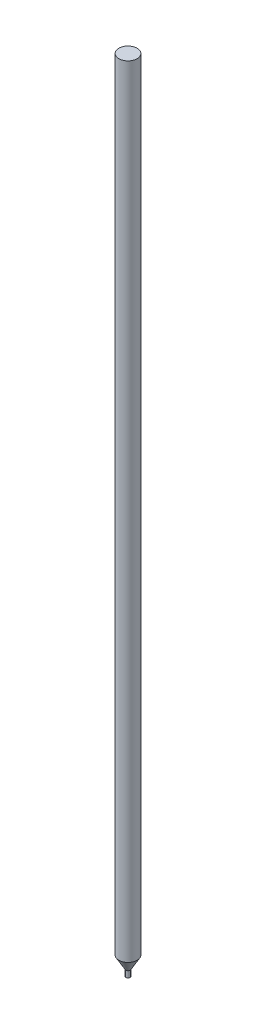
ISO-10303-21;
HEADER;
FILE_DESCRIPTION(('STEP AP214'),'2;1');
FILE_NAME('part.step','',(''),(''),'','','');
FILE_SCHEMA(('AUTOMOTIVE_DESIGN { 1 0 10303 214 1 1 1 1 }'));
ENDSEC;
DATA;
#1=APPLICATION_CONTEXT('core data for automotive mechanical design processes');
#2=APPLICATION_PROTOCOL_DEFINITION('international standard','automotive_design',2000,#1);
#3=PRODUCT_CONTEXT('',#1,'mechanical');
#4=PRODUCT('Part','Part','',(#3));
#5=PRODUCT_RELATED_PRODUCT_CATEGORY('part','',(#4));
#6=PRODUCT_DEFINITION_FORMATION('','',#4);
#7=PRODUCT_DEFINITION_CONTEXT('part definition',#1,'design');
#8=PRODUCT_DEFINITION('design','',#6,#7);
#9=PRODUCT_DEFINITION_SHAPE('','',#8);
#10=(LENGTH_UNIT() NAMED_UNIT(*) SI_UNIT(.MILLI.,.METRE.));
#11=(NAMED_UNIT(*) PLANE_ANGLE_UNIT() SI_UNIT($,.RADIAN.));
#12=(NAMED_UNIT(*) SI_UNIT($,.STERADIAN.) SOLID_ANGLE_UNIT());
#13=UNCERTAINTY_MEASURE_WITH_UNIT(LENGTH_MEASURE(1.E-05),#10,'distance_accuracy_value','');
#14=(GEOMETRIC_REPRESENTATION_CONTEXT(3) GLOBAL_UNCERTAINTY_ASSIGNED_CONTEXT((#13)) GLOBAL_UNIT_ASSIGNED_CONTEXT((#10,
#11,#12)) REPRESENTATION_CONTEXT('',''));
#15=CARTESIAN_POINT('',(0.,0.,0.));
#16=DIRECTION('',(0.,0.,1.));
#17=DIRECTION('',(1.,0.,0.));
#18=AXIS2_PLACEMENT_3D('',#15,#16,#17);
#19=CARTESIAN_POINT('',(0.,75.,0.));
#20=DIRECTION('',(0.,-1.,0.));
#21=DIRECTION('',(0.,0.,-1.));
#22=AXIS2_PLACEMENT_3D('',#19,#20,#21);
#23=CYLINDRICAL_SURFACE('',#22,0.875000000000001);
#24=CARTESIAN_POINT('',(0.,75.,0.));
#25=DIRECTION('',(0.,1.,0.));
#26=DIRECTION('',(0.,0.,1.));
#27=AXIS2_PLACEMENT_3D('',#24,#25,#26);
#28=CIRCLE('',#27,0.875000000000001);
#29=CARTESIAN_POINT('',(0.,75.,0.875000000000001));
#30=VERTEX_POINT('',#29);
#31=EDGE_CURVE('E10',#30,#30,#28,.T.);
#32=ORIENTED_EDGE('',*,*,#31,.F.);
#33=EDGE_LOOP('',(#32));
#34=FACE_BOUND('',#33,.T.);
#35=CARTESIAN_POINT('',(0.,0.,0.));
#36=DIRECTION('',(0.,1.,0.));
#37=DIRECTION('',(0.,0.,1.));
#38=AXIS2_PLACEMENT_3D('',#35,#36,#37);
#39=CIRCLE('',#38,0.875000000000001);
#40=CARTESIAN_POINT('',(0.,0.,0.875000000000001));
#41=VERTEX_POINT('',#40);
#42=EDGE_CURVE('E51',#41,#41,#39,.T.);
#43=ORIENTED_EDGE('',*,*,#42,.T.);
#44=EDGE_LOOP('',(#43));
#45=FACE_BOUND('',#44,.T.);
#46=ADVANCED_FACE('F37',(#34,#45),#23,.T.);
#47=CARTESIAN_POINT('',(0.,75.,0.));
#48=DIRECTION('',(0.,1.,0.));
#49=DIRECTION('',(0.,0.,1.));
#50=AXIS2_PLACEMENT_3D('',#47,#48,#49);
#51=PLANE('',#50);
#52=ORIENTED_EDGE('',*,*,#31,.T.);
#53=EDGE_LOOP('',(#52));
#54=FACE_BOUND('',#53,.T.);
#55=ADVANCED_FACE('F71',(#54),#51,.T.);
#56=CARTESIAN_POINT('',(0.,-1.76913429510898,0.));
#57=DIRECTION('',(0.,1.,0.));
#58=DIRECTION('',(0.,0.,1.));
#59=AXIS2_PLACEMENT_3D('',#56,#57,#58);
#60=PLANE('',#59);
#61=CARTESIAN_POINT('',(0.,-1.76913429510898,0.));
#62=DIRECTION('',(0.,1.,0.));
#63=DIRECTION('',(0.,0.,1.));
#64=AXIS2_PLACEMENT_3D('',#61,#62,#63);
#65=CIRCLE('',#64,0.2);
#66=CARTESIAN_POINT('',(0.,-1.76913429510898,0.2));
#67=VERTEX_POINT('',#66);
#68=EDGE_CURVE('E43',#67,#67,#65,.T.);
#69=ORIENTED_EDGE('',*,*,#68,.F.);
#70=EDGE_LOOP('',(#69));
#71=FACE_BOUND('',#70,.T.);
#72=ADVANCED_FACE('F66',(#71),#60,.F.);
#73=CARTESIAN_POINT('',(0.,0.,0.));
#74=DIRECTION('',(0.,1.,0.));
#75=DIRECTION('',(0.,0.,1.));
#76=AXIS2_PLACEMENT_3D('',#73,#74,#75);
#77=CYLINDRICAL_SURFACE('',#76,0.2);
#78=CARTESIAN_POINT('',(0.,-1.16913429510898,0.));
#79=DIRECTION('',(0.,1.,0.));
#80=DIRECTION('',(0.,0.,1.));
#81=AXIS2_PLACEMENT_3D('',#78,#79,#80);
#82=CIRCLE('',#81,0.2);
#83=CARTESIAN_POINT('',(0.,-1.16913429510898,0.2));
#84=VERTEX_POINT('',#83);
#85=EDGE_CURVE('E47',#84,#84,#82,.T.);
#86=ORIENTED_EDGE('',*,*,#85,.F.);
#87=EDGE_LOOP('',(#86));
#88=FACE_BOUND('',#87,.T.);
#89=ORIENTED_EDGE('',*,*,#68,.T.);
#90=EDGE_LOOP('',(#89));
#91=FACE_BOUND('',#90,.T.);
#92=ADVANCED_FACE('F61',(#88,#91),#77,.T.);
#93=CARTESIAN_POINT('',(0.,-1.16913429510898,0.));
#94=DIRECTION('',(0.,1.,0.));
#95=DIRECTION('',(0.,0.,1.));
#96=AXIS2_PLACEMENT_3D('',#93,#94,#95);
#97=CONICAL_SURFACE('',#96,0.2,0.523598775598304);
#98=CARTESIAN_POINT('',(0.,0.,0.875000000000001));
#99=CARTESIAN_POINT('',(0.,-0.0121784822407188,0.867968750000001));
#100=CARTESIAN_POINT('',(0.,-0.0243569644814373,0.860937500000001));
#101=CARTESIAN_POINT('',(0.,-0.0487139289628744,0.846875000000001));
#102=CARTESIAN_POINT('',(0.,-0.060892411203593,0.839843750000001));
#103=CARTESIAN_POINT('',(0.,-0.0852493756850301,0.825781250000001));
#104=CARTESIAN_POINT('',(0.,-0.0974278579257487,0.818750000000001));
#105=CARTESIAN_POINT('',(0.,-0.121784822407186,0.804687500000001));
#106=CARTESIAN_POINT('',(0.,-0.133963304647904,0.797656250000001));
#107=CARTESIAN_POINT('',(0.,-0.158320269129341,0.783593750000001));
#108=CARTESIAN_POINT('',(0.,-0.17049875137006,0.776562500000001));
#109=CARTESIAN_POINT('',(0.,-0.194855715851497,0.762500000000001));
#110=CARTESIAN_POINT('',(0.,-0.207034198092216,0.755468750000001));
#111=CARTESIAN_POINT('',(0.,-0.231391162573653,0.741406250000001));
#112=CARTESIAN_POINT('',(0.,-0.243569644814371,0.734375000000001));
#113=CARTESIAN_POINT('',(0.,-0.267926609295808,0.720312500000001));
#114=CARTESIAN_POINT('',(0.,-0.280105091536527,0.713281250000001));
#115=CARTESIAN_POINT('',(0.,-0.304462056017964,0.699218750000001));
#116=CARTESIAN_POINT('',(0.,-0.316640538258683,0.692187500000001));
#117=CARTESIAN_POINT('',(0.,-0.34099750274012,0.678125000000001));
#118=CARTESIAN_POINT('',(0.,-0.353175984980838,0.671093750000001));
#119=CARTESIAN_POINT('',(0.,-0.377532949462275,0.657031250000001));
#120=CARTESIAN_POINT('',(0.,-0.389711431702994,0.650000000000001));
#121=CARTESIAN_POINT('',(0.,-0.414068396184431,0.635937500000001));
#122=CARTESIAN_POINT('',(0.,-0.42624687842515,0.628906250000001));
#123=CARTESIAN_POINT('',(0.,-0.450603842906587,0.614843750000001));
#124=CARTESIAN_POINT('',(0.,-0.462782325147305,0.607812500000001));
#125=CARTESIAN_POINT('',(0.,-0.487139289628742,0.593750000000001));
#126=CARTESIAN_POINT('',(0.,-0.499317771869461,0.586718750000001));
#127=CARTESIAN_POINT('',(0.,-0.523674736350898,0.572656250000001));
#128=CARTESIAN_POINT('',(0.,-0.535853218591617,0.565625000000001));
#129=CARTESIAN_POINT('',(0.,-0.560210183073054,0.551562500000001));
#130=CARTESIAN_POINT('',(0.,-0.572388665313772,0.544531250000001));
#131=CARTESIAN_POINT('',(0.,-0.596745629795209,0.530468750000001));
#132=CARTESIAN_POINT('',(0.,-0.608924112035928,0.523437500000001));
#133=CARTESIAN_POINT('',(0.,-0.633281076517365,0.509375000000001));
#134=CARTESIAN_POINT('',(0.,-0.645459558758084,0.502343750000001));
#135=CARTESIAN_POINT('',(0.,-0.669816523239521,0.488281250000001));
#136=CARTESIAN_POINT('',(0.,-0.681995005480239,0.481250000000001));
#137=CARTESIAN_POINT('',(0.,-0.706351969961676,0.467187500000001));
#138=CARTESIAN_POINT('',(0.,-0.718530452202395,0.460156250000001));
#139=CARTESIAN_POINT('',(0.,-0.742887416683832,0.446093750000001));
#140=CARTESIAN_POINT('',(0.,-0.75506589892455,0.4390625));
#141=CARTESIAN_POINT('',(0.,-0.779422863405987,0.425000000000001));
#142=CARTESIAN_POINT('',(0.,-0.791601345646706,0.417968750000001));
#143=CARTESIAN_POINT('',(0.,-0.815958310128143,0.403906250000001));
#144=CARTESIAN_POINT('',(0.,-0.828136792368862,0.396875));
#145=CARTESIAN_POINT('',(0.,-0.852493756850299,0.3828125));
#146=CARTESIAN_POINT('',(0.,-0.864672239091017,0.37578125));
#147=CARTESIAN_POINT('',(0.,-0.889029203572454,0.36171875));
#148=CARTESIAN_POINT('',(0.,-0.901207685813173,0.3546875));
#149=CARTESIAN_POINT('',(0.,-0.92556465029461,0.340625));
#150=CARTESIAN_POINT('',(0.,-0.937743132535329,0.33359375));
#151=CARTESIAN_POINT('',(0.,-0.962100097016766,0.31953125));
#152=CARTESIAN_POINT('',(0.,-0.974278579257484,0.3125));
#153=CARTESIAN_POINT('',(0.,-0.998635543738921,0.2984375));
#154=CARTESIAN_POINT('',(0.,-1.01081402597964,0.29140625));
#155=CARTESIAN_POINT('',(0.,-1.03517099046108,0.27734375));
#156=CARTESIAN_POINT('',(0.,-1.0473494727018,0.2703125));
#157=CARTESIAN_POINT('',(0.,-1.07170643718323,0.25625));
#158=CARTESIAN_POINT('',(0.,-1.08388491942395,0.24921875));
#159=CARTESIAN_POINT('',(0.,-1.10824188390539,0.23515625));
#160=CARTESIAN_POINT('',(0.,-1.12042036614611,0.228125));
#161=CARTESIAN_POINT('',(0.,-1.14477733062754,0.2140625));
#162=CARTESIAN_POINT('',(0.,-1.15695581286826,0.20703125));
#163=CARTESIAN_POINT('',(0.,-1.16913429510898,0.2));
#164=B_SPLINE_CURVE_WITH_KNOTS('',3,(#98,#99,#100,#101,#102,#103,#104,#105,#106,#107,#108,#109,
#110,#111,#112,#113,#114,#115,#116,#117,#118,#119,#120,#121,#122,#123,#124,#125,#126,#127,#128,
#129,#130,#131,#132,#133,#134,#135,#136,#137,#138,#139,#140,#141,#142,#143,#144,#145,#146,#147,
#148,#149,#150,#151,#152,#153,#154,#155,#156,#157,#158,#159,#160,#161,#162,#163),.UNSPECIFIED.,
.F.,.F.,(4,2,2,2,2,2,2,2,2,2,2,2,2,2,2,2,2,2,2,2,2,2,2,2,2,2,2,2,2,2,2,2,4),(0.,
0.0421874999999997,0.0843749999999995,0.126562499999999,0.168749999999999,0.210937499999999,
0.253124999999998,0.295312499999998,0.337499999999998,0.379687499999998,0.421874999999997,
0.464062499999997,0.506249999999997,0.548437499999996,0.590624999999996,0.632812499999996,
0.674999999999995,0.717187499999995,0.759374999999995,0.801562499999995,0.843749999999994,
0.885937499999994,0.928124999999994,0.970312499999993,1.01249999999999,1.05468749999999,
1.09687499999999,1.13906249999999,1.18124999999999,1.22343749999999,1.26562499999999,
1.30781249999999,1.34999999999999),.UNSPECIFIED.);
#165=EDGE_CURVE('BSEAM58',#41,#84,#164,.T.);
#166=ORIENTED_EDGE('',*,*,#42,.F.);
#167=ORIENTED_EDGE('',*,*,#85,.T.);
#168=ORIENTED_EDGE('',*,*,#165,.T.);
#169=ORIENTED_EDGE('',*,*,#165,.F.);
#170=EDGE_LOOP('',(#166,#168,#167,#169));
#171=FACE_BOUND('',#170,.T.);
#172=ADVANCED_FACE('F58',(#171),#97,.T.);
#173=CLOSED_SHELL('',(#46,#55,#72,#92,#172));
#174=MANIFOLD_SOLID_BREP('B2',#173);
#175=ADVANCED_BREP_SHAPE_REPRESENTATION('',(#18,#174),#14);
#176=SHAPE_DEFINITION_REPRESENTATION(#9,#175);
ENDSEC;
END-ISO-10303-21;
